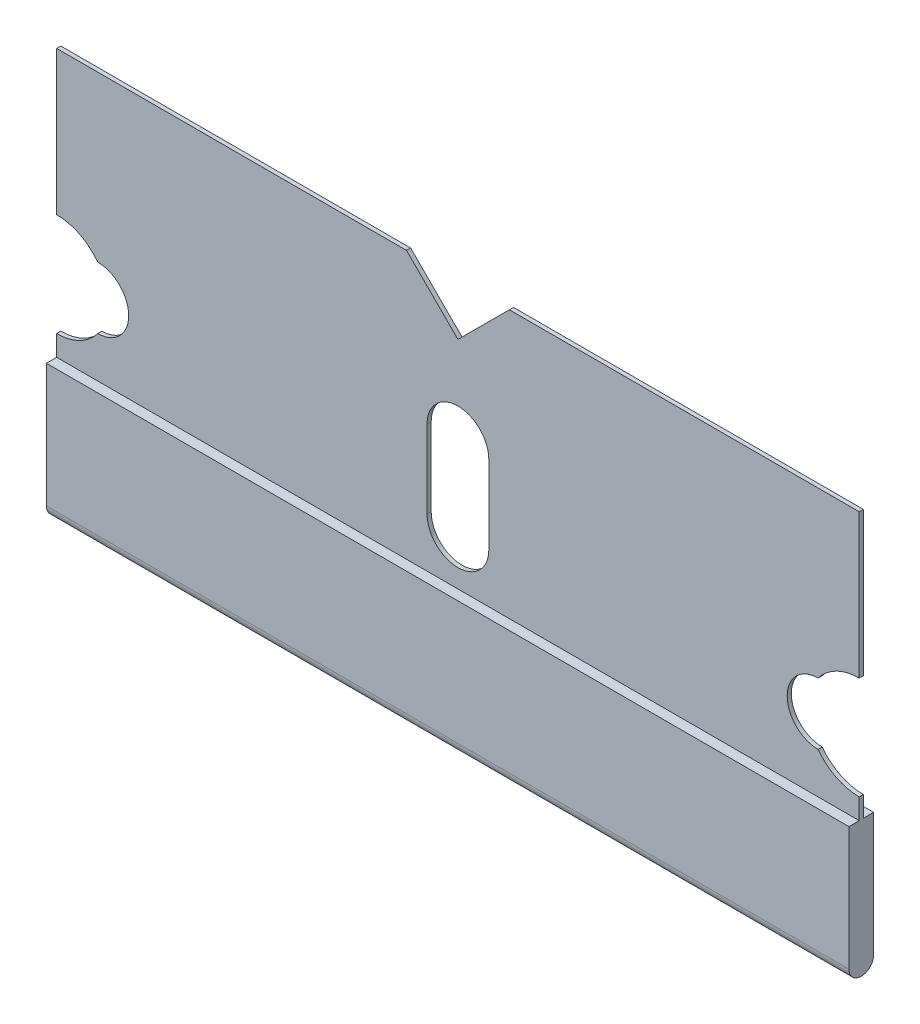
ISO-10303-21;
HEADER;
FILE_DESCRIPTION(('STEP AP214'),'2;1');
FILE_NAME('part.step','',(''),(''),'','','');
FILE_SCHEMA(('AUTOMOTIVE_DESIGN { 1 0 10303 214 1 1 1 1 }'));
ENDSEC;
DATA;
#1=APPLICATION_CONTEXT('core data for automotive mechanical design processes');
#2=APPLICATION_PROTOCOL_DEFINITION('international standard','automotive_design',2000,#1);
#3=PRODUCT_CONTEXT('',#1,'mechanical');
#4=PRODUCT('Part','Part','',(#3));
#5=PRODUCT_RELATED_PRODUCT_CATEGORY('part','',(#4));
#6=PRODUCT_DEFINITION_FORMATION('','',#4);
#7=PRODUCT_DEFINITION_CONTEXT('part definition',#1,'design');
#8=PRODUCT_DEFINITION('design','',#6,#7);
#9=PRODUCT_DEFINITION_SHAPE('','',#8);
#10=(LENGTH_UNIT() NAMED_UNIT(*) SI_UNIT(.MILLI.,.METRE.));
#11=(NAMED_UNIT(*) PLANE_ANGLE_UNIT() SI_UNIT($,.RADIAN.));
#12=(NAMED_UNIT(*) SI_UNIT($,.STERADIAN.) SOLID_ANGLE_UNIT());
#13=UNCERTAINTY_MEASURE_WITH_UNIT(LENGTH_MEASURE(1.E-05),#10,'distance_accuracy_value','');
#14=(GEOMETRIC_REPRESENTATION_CONTEXT(3) GLOBAL_UNCERTAINTY_ASSIGNED_CONTEXT((#13)) GLOBAL_UNIT_ASSIGNED_CONTEXT((#10,
#11,#12)) REPRESENTATION_CONTEXT('',''));
#15=CARTESIAN_POINT('',(0.,0.,0.));
#16=DIRECTION('',(0.,0.,1.));
#17=DIRECTION('',(1.,0.,0.));
#18=AXIS2_PLACEMENT_3D('',#15,#16,#17);
#19=CARTESIAN_POINT('',(0.,19.5,0.2));
#20=DIRECTION('',(0.,-1.,0.));
#21=DIRECTION('',(0.,0.,-1.));
#22=AXIS2_PLACEMENT_3D('',#19,#20,#21);
#23=PLANE('',#22);
#24=DIRECTION('',(-1.,0.,0.));
#25=VECTOR('',#24,1.);
#26=CARTESIAN_POINT('',(0.,19.5,0.));
#27=LINE('',#26,#25);
#28=CARTESIAN_POINT('',(39.,19.5,0.));
#29=VERTEX_POINT('',#28);
#30=CARTESIAN_POINT('',(22.,19.5,0.));
#31=VERTEX_POINT('',#30);
#32=EDGE_CURVE('E240',#29,#31,#27,.T.);
#33=ORIENTED_EDGE('',*,*,#32,.T.);
#34=DIRECTION('',(0.,0.,1.));
#35=VECTOR('',#34,1.);
#36=CARTESIAN_POINT('',(22.,19.5,0.2));
#37=LINE('',#36,#35);
#38=CARTESIAN_POINT('',(22.,19.5,0.2));
#39=VERTEX_POINT('',#38);
#40=EDGE_CURVE('E11',#31,#39,#37,.T.);
#41=ORIENTED_EDGE('',*,*,#40,.T.);
#42=DIRECTION('',(-1.,0.,0.));
#43=VECTOR('',#42,1.);
#44=CARTESIAN_POINT('',(0.,19.5,0.2));
#45=LINE('',#44,#43);
#46=CARTESIAN_POINT('',(39.,19.5,0.2));
#47=VERTEX_POINT('',#46);
#48=EDGE_CURVE('E209',#47,#39,#45,.T.);
#49=ORIENTED_EDGE('',*,*,#48,.F.);
#50=DIRECTION('',(0.,0.,-1.));
#51=VECTOR('',#50,1.);
#52=CARTESIAN_POINT('',(39.,19.5,0.2));
#53=LINE('',#52,#51);
#54=EDGE_CURVE('E264',#47,#29,#53,.T.);
#55=ORIENTED_EDGE('',*,*,#54,.T.);
#56=EDGE_LOOP('',(#33,#41,#49,#55));
#57=FACE_BOUND('',#56,.T.);
#58=ADVANCED_FACE('F34',(#57),#23,.F.);
#59=CARTESIAN_POINT('',(0.,10.,0.2));
#60=DIRECTION('',(0.,0.,-1.));
#61=DIRECTION('',(-1.,0.,0.));
#62=AXIS2_PLACEMENT_3D('',#59,#60,#61);
#63=PLANE('',#62);
#64=ORIENTED_EDGE('',*,*,#48,.T.);
#65=DIRECTION('',(0.707520964718265,0.706692354907095,0.));
#66=VECTOR('',#65,1.);
#67=CARTESIAN_POINT('',(22.,19.5,0.2));
#68=LINE('',#67,#66);
#69=CARTESIAN_POINT('',(19.5,17.002927863104,0.2));
#70=VERTEX_POINT('',#69);
#71=EDGE_CURVE('E203',#70,#39,#68,.T.);
#72=ORIENTED_EDGE('',*,*,#71,.F.);
#73=DIRECTION('',(0.707520964718265,-0.706692354907095,0.));
#74=VECTOR('',#73,1.);
#75=CARTESIAN_POINT('',(17.,19.5,0.2));
#76=LINE('',#75,#74);
#77=CARTESIAN_POINT('',(17.,19.5,0.2));
#78=VERTEX_POINT('',#77);
#79=EDGE_CURVE('E191',#78,#70,#76,.T.);
#80=ORIENTED_EDGE('',*,*,#79,.F.);
#81=CARTESIAN_POINT('',(0.,19.5,0.2));
#82=VERTEX_POINT('',#81);
#83=EDGE_CURVE('E201',#78,#82,#45,.T.);
#84=ORIENTED_EDGE('',*,*,#83,.T.);
#85=DIRECTION('',(0.,-1.,0.));
#86=VECTOR('',#85,1.);
#87=CARTESIAN_POINT('',(0.,12.5,0.2));
#88=LINE('',#87,#86);
#89=CARTESIAN_POINT('',(0.,12.5,0.2));
#90=VERTEX_POINT('',#89);
#91=EDGE_CURVE('E212',#82,#90,#88,.T.);
#92=ORIENTED_EDGE('',*,*,#91,.T.);
#93=CARTESIAN_POINT('',(0.,10.,0.2));
#94=DIRECTION('',(0.,0.,-1.));
#95=DIRECTION('',(-1.,0.,0.));
#96=AXIS2_PLACEMENT_3D('',#93,#94,#95);
#97=CIRCLE('',#96,2.5);
#98=CARTESIAN_POINT('',(1.99999999999999,11.5,0.2));
#99=VERTEX_POINT('',#98);
#100=EDGE_CURVE('E218',#90,#99,#97,.T.);
#101=ORIENTED_EDGE('',*,*,#100,.T.);
#102=CARTESIAN_POINT('',(1.99999999999999,10.,0.2));
#103=DIRECTION('',(0.,0.,-1.));
#104=DIRECTION('',(-1.,0.,0.));
#105=AXIS2_PLACEMENT_3D('',#102,#103,#104);
#106=CIRCLE('',#105,1.5);
#107=CARTESIAN_POINT('',(2.,8.49999999999999,0.2));
#108=VERTEX_POINT('',#107);
#109=EDGE_CURVE('E220',#99,#108,#106,.T.);
#110=ORIENTED_EDGE('',*,*,#109,.T.);
#111=CARTESIAN_POINT('',(0.,10.,0.2));
#112=DIRECTION('',(0.,0.,-1.));
#113=DIRECTION('',(-1.,0.,0.));
#114=AXIS2_PLACEMENT_3D('',#111,#112,#113);
#115=CIRCLE('',#114,2.5);
#116=CARTESIAN_POINT('',(0.,7.5,0.2));
#117=VERTEX_POINT('',#116);
#118=EDGE_CURVE('E222',#108,#117,#115,.T.);
#119=ORIENTED_EDGE('',*,*,#118,.T.);
#120=DIRECTION('',(0.,-1.,0.));
#121=VECTOR('',#120,1.);
#122=CARTESIAN_POINT('',(0.,0.,0.2));
#123=LINE('',#122,#121);
#124=CARTESIAN_POINT('',(0.,6.5,0.2));
#125=VERTEX_POINT('',#124);
#126=EDGE_CURVE('E251',#117,#125,#123,.T.);
#127=ORIENTED_EDGE('',*,*,#126,.T.);
#128=DIRECTION('',(1.,0.,0.));
#129=VECTOR('',#128,1.);
#130=CARTESIAN_POINT('',(-6.70820393249936,6.5,0.2));
#131=LINE('',#130,#129);
#132=CARTESIAN_POINT('',(39.,6.5,0.2));
#133=VERTEX_POINT('',#132);
#134=EDGE_CURVE('E351',#125,#133,#131,.T.);
#135=ORIENTED_EDGE('',*,*,#134,.T.);
#136=DIRECTION('',(0.,1.,0.));
#137=VECTOR('',#136,1.);
#138=CARTESIAN_POINT('',(39.,0.,0.2));
#139=LINE('',#138,#137);
#140=CARTESIAN_POINT('',(39.,7.5,0.2));
#141=VERTEX_POINT('',#140);
#142=EDGE_CURVE('E307',#133,#141,#139,.T.);
#143=ORIENTED_EDGE('',*,*,#142,.T.);
#144=CARTESIAN_POINT('',(39.,10.,0.2));
#145=DIRECTION('',(0.,0.,-1.));
#146=DIRECTION('',(1.,0.,0.));
#147=AXIS2_PLACEMENT_3D('',#144,#145,#146);
#148=CIRCLE('',#147,2.5);
#149=CARTESIAN_POINT('',(37.,8.49999999999999,0.2));
#150=VERTEX_POINT('',#149);
#151=EDGE_CURVE('E283',#141,#150,#148,.T.);
#152=ORIENTED_EDGE('',*,*,#151,.T.);
#153=CARTESIAN_POINT('',(37.,10.,0.2));
#154=DIRECTION('',(0.,0.,-1.));
#155=DIRECTION('',(1.,0.,0.));
#156=AXIS2_PLACEMENT_3D('',#153,#154,#155);
#157=CIRCLE('',#156,1.5);
#158=CARTESIAN_POINT('',(37.,11.5,0.2));
#159=VERTEX_POINT('',#158);
#160=EDGE_CURVE('E303',#150,#159,#157,.T.);
#161=ORIENTED_EDGE('',*,*,#160,.T.);
#162=CARTESIAN_POINT('',(39.,10.,0.2));
#163=DIRECTION('',(0.,0.,-1.));
#164=DIRECTION('',(1.,0.,0.));
#165=AXIS2_PLACEMENT_3D('',#162,#163,#164);
#166=CIRCLE('',#165,2.5);
#167=CARTESIAN_POINT('',(39.,12.5,0.2));
#168=VERTEX_POINT('',#167);
#169=EDGE_CURVE('E213',#159,#168,#166,.T.);
#170=ORIENTED_EDGE('',*,*,#169,.T.);
#171=DIRECTION('',(0.,1.,0.));
#172=VECTOR('',#171,1.);
#173=CARTESIAN_POINT('',(39.,12.5,0.2));
#174=LINE('',#173,#172);
#175=EDGE_CURVE('E210',#168,#47,#174,.T.);
#176=ORIENTED_EDGE('',*,*,#175,.T.);
#177=EDGE_LOOP('',(#64,#72,#80,#84,#92,#101,#110,#119,#127,#135,#143,#152,#161,#170,#176));
#178=FACE_BOUND('',#177,.T.);
#179=CARTESIAN_POINT('',(19.5,12.7,0.2));
#180=DIRECTION('',(0.,0.,1.));
#181=DIRECTION('',(1.,0.,0.));
#182=AXIS2_PLACEMENT_3D('',#179,#180,#181);
#183=CIRCLE('',#182,1.49999999999999);
#184=CARTESIAN_POINT('',(21.,12.7,0.2));
#185=VERTEX_POINT('',#184);
#186=CARTESIAN_POINT('',(18.,12.7,0.2));
#187=VERTEX_POINT('',#186);
#188=EDGE_CURVE('E324',#185,#187,#183,.T.);
#189=ORIENTED_EDGE('',*,*,#188,.F.);
#190=DIRECTION('',(0.,1.,0.));
#191=VECTOR('',#190,1.);
#192=CARTESIAN_POINT('',(21.,12.7,0.2));
#193=LINE('',#192,#191);
#194=CARTESIAN_POINT('',(21.,8.9,0.2));
#195=VERTEX_POINT('',#194);
#196=EDGE_CURVE('E320',#195,#185,#193,.T.);
#197=ORIENTED_EDGE('',*,*,#196,.F.);
#198=CARTESIAN_POINT('',(19.5,8.9,0.2));
#199=DIRECTION('',(0.,0.,1.));
#200=DIRECTION('',(1.,0.,0.));
#201=AXIS2_PLACEMENT_3D('',#198,#199,#200);
#202=CIRCLE('',#201,1.49999999999999);
#203=CARTESIAN_POINT('',(18.,8.9,0.2));
#204=VERTEX_POINT('',#203);
#205=EDGE_CURVE('E336',#204,#195,#202,.T.);
#206=ORIENTED_EDGE('',*,*,#205,.F.);
#207=DIRECTION('',(0.,-1.,0.));
#208=VECTOR('',#207,1.);
#209=CARTESIAN_POINT('',(18.,12.7,0.2));
#210=LINE('',#209,#208);
#211=EDGE_CURVE('E339',#187,#204,#210,.T.);
#212=ORIENTED_EDGE('',*,*,#211,.F.);
#213=EDGE_LOOP('',(#189,#197,#206,#212));
#214=FACE_BOUND('',#213,.T.);
#215=ADVANCED_FACE('F199',(#178,#214),#63,.F.);
#216=CARTESIAN_POINT('',(0.,10.,0.));
#217=DIRECTION('',(0.,0.,-1.));
#218=DIRECTION('',(-1.,0.,0.));
#219=AXIS2_PLACEMENT_3D('',#216,#217,#218);
#220=PLANE('',#219);
#221=DIRECTION('',(-0.707520964718265,-0.706692354907095,0.));
#222=VECTOR('',#221,1.);
#223=CARTESIAN_POINT('',(6.23711311997353,3.75557374993712,0.));
#224=LINE('',#223,#222);
#225=CARTESIAN_POINT('',(19.5,17.002927863104,0.));
#226=VERTEX_POINT('',#225);
#227=EDGE_CURVE('E370',#31,#226,#224,.T.);
#228=ORIENTED_EDGE('',*,*,#227,.F.);
#229=ORIENTED_EDGE('',*,*,#32,.F.);
#230=DIRECTION('',(0.,1.,0.));
#231=VECTOR('',#230,1.);
#232=CARTESIAN_POINT('',(39.,12.5,0.));
#233=LINE('',#232,#231);
#234=CARTESIAN_POINT('',(39.,12.5,0.));
#235=VERTEX_POINT('',#234);
#236=EDGE_CURVE('E237',#235,#29,#233,.T.);
#237=ORIENTED_EDGE('',*,*,#236,.F.);
#238=CARTESIAN_POINT('',(39.,10.,0.));
#239=DIRECTION('',(0.,0.,-1.));
#240=DIRECTION('',(1.,0.,0.));
#241=AXIS2_PLACEMENT_3D('',#238,#239,#240);
#242=CIRCLE('',#241,2.5);
#243=CARTESIAN_POINT('',(37.,11.5,0.));
#244=VERTEX_POINT('',#243);
#245=EDGE_CURVE('E235',#244,#235,#242,.T.);
#246=ORIENTED_EDGE('',*,*,#245,.F.);
#247=CARTESIAN_POINT('',(37.,10.,0.));
#248=DIRECTION('',(0.,0.,-1.));
#249=DIRECTION('',(1.,0.,0.));
#250=AXIS2_PLACEMENT_3D('',#247,#248,#249);
#251=CIRCLE('',#250,1.5);
#252=CARTESIAN_POINT('',(37.,8.49999999999999,0.));
#253=VERTEX_POINT('',#252);
#254=EDGE_CURVE('E233',#253,#244,#251,.T.);
#255=ORIENTED_EDGE('',*,*,#254,.F.);
#256=CARTESIAN_POINT('',(39.,10.,0.));
#257=DIRECTION('',(0.,0.,-1.));
#258=DIRECTION('',(1.,0.,0.));
#259=AXIS2_PLACEMENT_3D('',#256,#257,#258);
#260=CIRCLE('',#259,2.5);
#261=CARTESIAN_POINT('',(39.,7.5,0.));
#262=VERTEX_POINT('',#261);
#263=EDGE_CURVE('E231',#262,#253,#260,.T.);
#264=ORIENTED_EDGE('',*,*,#263,.F.);
#265=DIRECTION('',(0.,1.,0.));
#266=VECTOR('',#265,1.);
#267=CARTESIAN_POINT('',(39.,0.,0.));
#268=LINE('',#267,#266);
#269=CARTESIAN_POINT('',(39.,6.5,0.));
#270=VERTEX_POINT('',#269);
#271=EDGE_CURVE('E228',#270,#262,#268,.T.);
#272=ORIENTED_EDGE('',*,*,#271,.F.);
#273=DIRECTION('',(1.,0.,0.));
#274=VECTOR('',#273,1.);
#275=CARTESIAN_POINT('',(-6.70820393249936,6.5,0.));
#276=LINE('',#275,#274);
#277=CARTESIAN_POINT('',(0.,6.5,0.));
#278=VERTEX_POINT('',#277);
#279=EDGE_CURVE('E349',#278,#270,#276,.T.);
#280=ORIENTED_EDGE('',*,*,#279,.F.);
#281=DIRECTION('',(0.,-1.,0.));
#282=VECTOR('',#281,1.);
#283=CARTESIAN_POINT('',(0.,0.,0.));
#284=LINE('',#283,#282);
#285=CARTESIAN_POINT('',(0.,7.5,0.));
#286=VERTEX_POINT('',#285);
#287=EDGE_CURVE('E225',#286,#278,#284,.T.);
#288=ORIENTED_EDGE('',*,*,#287,.F.);
#289=CARTESIAN_POINT('',(0.,10.,0.));
#290=DIRECTION('',(0.,0.,-1.));
#291=DIRECTION('',(-1.,0.,0.));
#292=AXIS2_PLACEMENT_3D('',#289,#290,#291);
#293=CIRCLE('',#292,2.5);
#294=CARTESIAN_POINT('',(2.,8.49999999999999,0.));
#295=VERTEX_POINT('',#294);
#296=EDGE_CURVE('E249',#295,#286,#293,.T.);
#297=ORIENTED_EDGE('',*,*,#296,.F.);
#298=CARTESIAN_POINT('',(1.99999999999999,10.,0.));
#299=DIRECTION('',(0.,0.,-1.));
#300=DIRECTION('',(-1.,0.,0.));
#301=AXIS2_PLACEMENT_3D('',#298,#299,#300);
#302=CIRCLE('',#301,1.5);
#303=CARTESIAN_POINT('',(1.99999999999999,11.5,0.));
#304=VERTEX_POINT('',#303);
#305=EDGE_CURVE('E247',#304,#295,#302,.T.);
#306=ORIENTED_EDGE('',*,*,#305,.F.);
#307=CARTESIAN_POINT('',(0.,10.,0.));
#308=DIRECTION('',(0.,0.,-1.));
#309=DIRECTION('',(-1.,0.,0.));
#310=AXIS2_PLACEMENT_3D('',#307,#308,#309);
#311=CIRCLE('',#310,2.5);
#312=CARTESIAN_POINT('',(0.,12.5,0.));
#313=VERTEX_POINT('',#312);
#314=EDGE_CURVE('E245',#313,#304,#311,.T.);
#315=ORIENTED_EDGE('',*,*,#314,.F.);
#316=DIRECTION('',(0.,-1.,0.));
#317=VECTOR('',#316,1.);
#318=CARTESIAN_POINT('',(0.,12.5,0.));
#319=LINE('',#318,#317);
#320=CARTESIAN_POINT('',(0.,19.5,0.));
#321=VERTEX_POINT('',#320);
#322=EDGE_CURVE('E243',#321,#313,#319,.T.);
#323=ORIENTED_EDGE('',*,*,#322,.F.);
#324=CARTESIAN_POINT('',(17.,19.5,0.));
#325=VERTEX_POINT('',#324);
#326=EDGE_CURVE('E239',#325,#321,#27,.T.);
#327=ORIENTED_EDGE('',*,*,#326,.F.);
#328=DIRECTION('',(-0.707520964718265,0.706692354907095,0.));
#329=VECTOR('',#328,1.);
#330=CARTESIAN_POINT('',(13.2400361749078,23.2555603613499,0.));
#331=LINE('',#330,#329);
#332=EDGE_CURVE('E49',#226,#325,#331,.T.);
#333=ORIENTED_EDGE('',*,*,#332,.F.);
#334=EDGE_LOOP('',(#228,#229,#237,#246,#255,#264,#272,#280,#288,#297,#306,#315,#323,#327,#333));
#335=FACE_BOUND('',#334,.T.);
#336=DIRECTION('',(0.,1.,0.));
#337=VECTOR('',#336,1.);
#338=CARTESIAN_POINT('',(21.,12.7,0.));
#339=LINE('',#338,#337);
#340=CARTESIAN_POINT('',(21.,8.9,0.));
#341=VERTEX_POINT('',#340);
#342=CARTESIAN_POINT('',(21.,12.7,0.));
#343=VERTEX_POINT('',#342);
#344=EDGE_CURVE('E321',#341,#343,#339,.T.);
#345=ORIENTED_EDGE('',*,*,#344,.T.);
#346=CARTESIAN_POINT('',(19.5,12.7,0.));
#347=DIRECTION('',(0.,0.,1.));
#348=DIRECTION('',(1.,0.,0.));
#349=AXIS2_PLACEMENT_3D('',#346,#347,#348);
#350=CIRCLE('',#349,1.49999999999999);
#351=CARTESIAN_POINT('',(18.,12.7,0.));
#352=VERTEX_POINT('',#351);
#353=EDGE_CURVE('E331',#343,#352,#350,.T.);
#354=ORIENTED_EDGE('',*,*,#353,.T.);
#355=DIRECTION('',(0.,-1.,0.));
#356=VECTOR('',#355,1.);
#357=CARTESIAN_POINT('',(18.,12.7,0.));
#358=LINE('',#357,#356);
#359=CARTESIAN_POINT('',(18.,8.9,0.));
#360=VERTEX_POINT('',#359);
#361=EDGE_CURVE('E328',#352,#360,#358,.T.);
#362=ORIENTED_EDGE('',*,*,#361,.T.);
#363=CARTESIAN_POINT('',(19.5,8.9,0.));
#364=DIRECTION('',(0.,0.,1.));
#365=DIRECTION('',(1.,0.,0.));
#366=AXIS2_PLACEMENT_3D('',#363,#364,#365);
#367=CIRCLE('',#366,1.49999999999999);
#368=EDGE_CURVE('E325',#360,#341,#367,.T.);
#369=ORIENTED_EDGE('',*,*,#368,.T.);
#370=EDGE_LOOP('',(#345,#354,#362,#369));
#371=FACE_BOUND('',#370,.T.);
#372=ADVANCED_FACE('F289',(#335,#371),#220,.T.);
#373=CARTESIAN_POINT('',(0.,0.,0.2));
#374=DIRECTION('',(1.,0.,0.));
#375=DIRECTION('',(0.,1.,0.));
#376=AXIS2_PLACEMENT_3D('',#373,#374,#375);
#377=PLANE('',#376);
#378=ORIENTED_EDGE('',*,*,#287,.T.);
#379=DIRECTION('',(0.,0.,-1.));
#380=VECTOR('',#379,1.);
#381=CARTESIAN_POINT('',(0.,6.5,0.));
#382=LINE('',#381,#380);
#383=CARTESIAN_POINT('',(0.,6.5,-0.5));
#384=VERTEX_POINT('',#383);
#385=EDGE_CURVE('E358',#278,#384,#382,.T.);
#386=ORIENTED_EDGE('',*,*,#385,.T.);
#387=DIRECTION('',(0.,-1.,0.));
#388=VECTOR('',#387,1.);
#389=CARTESIAN_POINT('',(0.,0.500000000000006,-0.5));
#390=LINE('',#389,#388);
#391=CARTESIAN_POINT('',(0.,0.5,-0.5));
#392=VERTEX_POINT('',#391);
#393=EDGE_CURVE('E334',#384,#392,#390,.T.);
#394=ORIENTED_EDGE('',*,*,#393,.T.);
#395=CARTESIAN_POINT('',(0.,0.5,0.0999999999999999));
#396=DIRECTION('',(1.,0.,0.));
#397=DIRECTION('',(0.,1.,0.));
#398=AXIS2_PLACEMENT_3D('',#395,#396,#397);
#399=CIRCLE('',#398,0.6);
#400=CARTESIAN_POINT('',(0.,0.5,0.7));
#401=VERTEX_POINT('',#400);
#402=EDGE_CURVE('E343',#392,#401,#399,.F.);
#403=ORIENTED_EDGE('',*,*,#402,.T.);
#404=DIRECTION('',(0.,1.,0.));
#405=VECTOR('',#404,1.);
#406=CARTESIAN_POINT('',(0.,0.500000000000006,0.7));
#407=LINE('',#406,#405);
#408=CARTESIAN_POINT('',(0.,6.5,0.7));
#409=VERTEX_POINT('',#408);
#410=EDGE_CURVE('E372',#401,#409,#407,.T.);
#411=ORIENTED_EDGE('',*,*,#410,.T.);
#412=DIRECTION('',(0.,0.,-1.));
#413=VECTOR('',#412,1.);
#414=CARTESIAN_POINT('',(0.,6.5,0.7));
#415=LINE('',#414,#413);
#416=EDGE_CURVE('E374',#409,#125,#415,.T.);
#417=ORIENTED_EDGE('',*,*,#416,.T.);
#418=ORIENTED_EDGE('',*,*,#126,.F.);
#419=DIRECTION('',(0.,0.,-1.));
#420=VECTOR('',#419,1.);
#421=CARTESIAN_POINT('',(0.,7.5,0.2));
#422=LINE('',#421,#420);
#423=EDGE_CURVE('E224',#117,#286,#422,.T.);
#424=ORIENTED_EDGE('',*,*,#423,.T.);
#425=EDGE_LOOP('',(#378,#386,#394,#403,#411,#417,#418,#424));
#426=FACE_BOUND('',#425,.T.);
#427=ADVANCED_FACE('F36',(#426),#377,.F.);
#428=CARTESIAN_POINT('',(39.,0.,0.2));
#429=DIRECTION('',(-1.,0.,0.));
#430=DIRECTION('',(0.,0.,1.));
#431=AXIS2_PLACEMENT_3D('',#428,#429,#430);
#432=PLANE('',#431);
#433=ORIENTED_EDGE('',*,*,#142,.F.);
#434=DIRECTION('',(0.,0.,1.));
#435=VECTOR('',#434,1.);
#436=CARTESIAN_POINT('',(39.,6.5,0.7));
#437=LINE('',#436,#435);
#438=CARTESIAN_POINT('',(39.,6.5,0.7));
#439=VERTEX_POINT('',#438);
#440=EDGE_CURVE('E361',#133,#439,#437,.T.);
#441=ORIENTED_EDGE('',*,*,#440,.T.);
#442=DIRECTION('',(0.,-1.,0.));
#443=VECTOR('',#442,1.);
#444=CARTESIAN_POINT('',(39.,0.5,0.7));
#445=LINE('',#444,#443);
#446=CARTESIAN_POINT('',(39.,0.5,0.7));
#447=VERTEX_POINT('',#446);
#448=EDGE_CURVE('E347',#439,#447,#445,.T.);
#449=ORIENTED_EDGE('',*,*,#448,.T.);
#450=CARTESIAN_POINT('',(39.,0.5,0.0999999999999999));
#451=DIRECTION('',(1.,0.,0.));
#452=DIRECTION('',(0.,0.,-1.));
#453=AXIS2_PLACEMENT_3D('',#450,#451,#452);
#454=CIRCLE('',#453,0.6);
#455=CARTESIAN_POINT('',(39.,0.5,-0.5));
#456=VERTEX_POINT('',#455);
#457=EDGE_CURVE('E367',#447,#456,#454,.T.);
#458=ORIENTED_EDGE('',*,*,#457,.T.);
#459=DIRECTION('',(0.,1.,0.));
#460=VECTOR('',#459,1.);
#461=CARTESIAN_POINT('',(39.,0.5,-0.5));
#462=LINE('',#461,#460);
#463=CARTESIAN_POINT('',(39.,6.5,-0.5));
#464=VERTEX_POINT('',#463);
#465=EDGE_CURVE('E365',#456,#464,#462,.T.);
#466=ORIENTED_EDGE('',*,*,#465,.T.);
#467=DIRECTION('',(0.,0.,1.));
#468=VECTOR('',#467,1.);
#469=CARTESIAN_POINT('',(39.,6.5,0.));
#470=LINE('',#469,#468);
#471=EDGE_CURVE('E57',#464,#270,#470,.T.);
#472=ORIENTED_EDGE('',*,*,#471,.T.);
#473=ORIENTED_EDGE('',*,*,#271,.T.);
#474=DIRECTION('',(0.,0.,-1.));
#475=VECTOR('',#474,1.);
#476=CARTESIAN_POINT('',(39.,7.5,0.2));
#477=LINE('',#476,#475);
#478=EDGE_CURVE('E196',#141,#262,#477,.T.);
#479=ORIENTED_EDGE('',*,*,#478,.F.);
#480=EDGE_LOOP('',(#433,#441,#449,#458,#466,#472,#473,#479));
#481=FACE_BOUND('',#480,.T.);
#482=ADVANCED_FACE('F418',(#481),#432,.F.);
#483=CARTESIAN_POINT('',(39.,10.,0.2));
#484=DIRECTION('',(0.,0.,-1.));
#485=DIRECTION('',(-1.,0.,0.));
#486=AXIS2_PLACEMENT_3D('',#483,#484,#485);
#487=CYLINDRICAL_SURFACE('',#486,2.5);
#488=ORIENTED_EDGE('',*,*,#263,.T.);
#489=DIRECTION('',(0.,0.,-1.));
#490=VECTOR('',#489,1.);
#491=CARTESIAN_POINT('',(37.,8.49999999999999,0.2));
#492=LINE('',#491,#490);
#493=EDGE_CURVE('E273',#150,#253,#492,.T.);
#494=ORIENTED_EDGE('',*,*,#493,.F.);
#495=ORIENTED_EDGE('',*,*,#151,.F.);
#496=ORIENTED_EDGE('',*,*,#478,.T.);
#497=EDGE_LOOP('',(#488,#494,#495,#496));
#498=FACE_BOUND('',#497,.T.);
#499=ADVANCED_FACE('F281',(#498),#487,.F.);
#500=CARTESIAN_POINT('',(37.,10.,0.2));
#501=DIRECTION('',(0.,0.,-1.));
#502=DIRECTION('',(-1.,0.,0.));
#503=AXIS2_PLACEMENT_3D('',#500,#501,#502);
#504=CYLINDRICAL_SURFACE('',#503,1.5);
#505=ORIENTED_EDGE('',*,*,#254,.T.);
#506=DIRECTION('',(0.,0.,-1.));
#507=VECTOR('',#506,1.);
#508=CARTESIAN_POINT('',(37.,11.5,0.2));
#509=LINE('',#508,#507);
#510=EDGE_CURVE('E270',#159,#244,#509,.T.);
#511=ORIENTED_EDGE('',*,*,#510,.F.);
#512=ORIENTED_EDGE('',*,*,#160,.F.);
#513=ORIENTED_EDGE('',*,*,#493,.T.);
#514=EDGE_LOOP('',(#505,#511,#512,#513));
#515=FACE_BOUND('',#514,.T.);
#516=ADVANCED_FACE('F296',(#515),#504,.F.);
#517=CARTESIAN_POINT('',(39.,10.,0.2));
#518=DIRECTION('',(0.,0.,-1.));
#519=DIRECTION('',(-1.,0.,0.));
#520=AXIS2_PLACEMENT_3D('',#517,#518,#519);
#521=CYLINDRICAL_SURFACE('',#520,2.5);
#522=ORIENTED_EDGE('',*,*,#245,.T.);
#523=DIRECTION('',(0.,0.,-1.));
#524=VECTOR('',#523,1.);
#525=CARTESIAN_POINT('',(39.,12.5,0.2));
#526=LINE('',#525,#524);
#527=EDGE_CURVE('E267',#168,#235,#526,.T.);
#528=ORIENTED_EDGE('',*,*,#527,.F.);
#529=ORIENTED_EDGE('',*,*,#169,.F.);
#530=ORIENTED_EDGE('',*,*,#510,.T.);
#531=EDGE_LOOP('',(#522,#528,#529,#530));
#532=FACE_BOUND('',#531,.T.);
#533=ADVANCED_FACE('F300',(#532),#521,.F.);
#534=CARTESIAN_POINT('',(39.,12.5,0.2));
#535=DIRECTION('',(-1.,0.,0.));
#536=DIRECTION('',(0.,0.,1.));
#537=AXIS2_PLACEMENT_3D('',#534,#535,#536);
#538=PLANE('',#537);
#539=ORIENTED_EDGE('',*,*,#236,.T.);
#540=ORIENTED_EDGE('',*,*,#54,.F.);
#541=ORIENTED_EDGE('',*,*,#175,.F.);
#542=ORIENTED_EDGE('',*,*,#527,.T.);
#543=EDGE_LOOP('',(#539,#540,#541,#542));
#544=FACE_BOUND('',#543,.T.);
#545=ADVANCED_FACE('F388',(#544),#538,.F.);
#546=ORIENTED_EDGE('',*,*,#83,.F.);
#547=DIRECTION('',(0.,0.,-1.));
#548=VECTOR('',#547,1.);
#549=CARTESIAN_POINT('',(17.,19.5,0.2));
#550=LINE('',#549,#548);
#551=EDGE_CURVE('E42',#78,#325,#550,.T.);
#552=ORIENTED_EDGE('',*,*,#551,.T.);
#553=ORIENTED_EDGE('',*,*,#326,.T.);
#554=DIRECTION('',(0.,0.,-1.));
#555=VECTOR('',#554,1.);
#556=CARTESIAN_POINT('',(0.,19.5,0.2));
#557=LINE('',#556,#555);
#558=EDGE_CURVE('E207',#82,#321,#557,.T.);
#559=ORIENTED_EDGE('',*,*,#558,.F.);
#560=EDGE_LOOP('',(#546,#552,#553,#559));
#561=FACE_BOUND('',#560,.T.);
#562=ADVANCED_FACE('F205',(#561),#23,.F.);
#563=CARTESIAN_POINT('',(0.,12.5,0.2));
#564=DIRECTION('',(1.,0.,0.));
#565=DIRECTION('',(0.,1.,0.));
#566=AXIS2_PLACEMENT_3D('',#563,#564,#565);
#567=PLANE('',#566);
#568=ORIENTED_EDGE('',*,*,#322,.T.);
#569=DIRECTION('',(0.,0.,-1.));
#570=VECTOR('',#569,1.);
#571=CARTESIAN_POINT('',(0.,12.5,0.2));
#572=LINE('',#571,#570);
#573=EDGE_CURVE('E260',#90,#313,#572,.T.);
#574=ORIENTED_EDGE('',*,*,#573,.F.);
#575=ORIENTED_EDGE('',*,*,#91,.F.);
#576=ORIENTED_EDGE('',*,*,#558,.T.);
#577=EDGE_LOOP('',(#568,#574,#575,#576));
#578=FACE_BOUND('',#577,.T.);
#579=ADVANCED_FACE('F392',(#578),#567,.F.);
#580=CARTESIAN_POINT('',(0.,10.,0.2));
#581=DIRECTION('',(0.,0.,-1.));
#582=DIRECTION('',(-1.,0.,0.));
#583=AXIS2_PLACEMENT_3D('',#580,#581,#582);
#584=CYLINDRICAL_SURFACE('',#583,2.5);
#585=ORIENTED_EDGE('',*,*,#314,.T.);
#586=DIRECTION('',(0.,0.,-1.));
#587=VECTOR('',#586,1.);
#588=CARTESIAN_POINT('',(1.99999999999999,11.5,0.2));
#589=LINE('',#588,#587);
#590=EDGE_CURVE('E257',#99,#304,#589,.T.);
#591=ORIENTED_EDGE('',*,*,#590,.F.);
#592=ORIENTED_EDGE('',*,*,#100,.F.);
#593=ORIENTED_EDGE('',*,*,#573,.T.);
#594=EDGE_LOOP('',(#585,#591,#592,#593));
#595=FACE_BOUND('',#594,.T.);
#596=ADVANCED_FACE('F399',(#595),#584,.F.);
#597=CARTESIAN_POINT('',(1.99999999999999,10.,0.2));
#598=DIRECTION('',(0.,0.,-1.));
#599=DIRECTION('',(-1.,0.,0.));
#600=AXIS2_PLACEMENT_3D('',#597,#598,#599);
#601=CYLINDRICAL_SURFACE('',#600,1.5);
#602=ORIENTED_EDGE('',*,*,#305,.T.);
#603=DIRECTION('',(0.,0.,-1.));
#604=VECTOR('',#603,1.);
#605=CARTESIAN_POINT('',(2.,8.49999999999999,0.2));
#606=LINE('',#605,#604);
#607=EDGE_CURVE('E254',#108,#295,#606,.T.);
#608=ORIENTED_EDGE('',*,*,#607,.F.);
#609=ORIENTED_EDGE('',*,*,#109,.F.);
#610=ORIENTED_EDGE('',*,*,#590,.T.);
#611=EDGE_LOOP('',(#602,#608,#609,#610));
#612=FACE_BOUND('',#611,.T.);
#613=ADVANCED_FACE('F402',(#612),#601,.F.);
#614=CARTESIAN_POINT('',(0.,10.,0.2));
#615=DIRECTION('',(0.,0.,-1.));
#616=DIRECTION('',(-1.,0.,0.));
#617=AXIS2_PLACEMENT_3D('',#614,#615,#616);
#618=CYLINDRICAL_SURFACE('',#617,2.5);
#619=ORIENTED_EDGE('',*,*,#296,.T.);
#620=ORIENTED_EDGE('',*,*,#423,.F.);
#621=ORIENTED_EDGE('',*,*,#118,.F.);
#622=ORIENTED_EDGE('',*,*,#607,.T.);
#623=EDGE_LOOP('',(#619,#620,#621,#622));
#624=FACE_BOUND('',#623,.T.);
#625=ADVANCED_FACE('F407',(#624),#618,.F.);
#626=CARTESIAN_POINT('',(19.5,12.7,0.2));
#627=DIRECTION('',(0.,0.,-1.));
#628=DIRECTION('',(-1.,0.,0.));
#629=AXIS2_PLACEMENT_3D('',#626,#627,#628);
#630=CYLINDRICAL_SURFACE('',#629,1.49999999999999);
#631=ORIENTED_EDGE('',*,*,#353,.F.);
#632=DIRECTION('',(0.,0.,-1.));
#633=VECTOR('',#632,1.);
#634=CARTESIAN_POINT('',(21.,12.7,0.2));
#635=LINE('',#634,#633);
#636=EDGE_CURVE('E317',#185,#343,#635,.T.);
#637=ORIENTED_EDGE('',*,*,#636,.F.);
#638=ORIENTED_EDGE('',*,*,#188,.T.);
#639=DIRECTION('',(0.,0.,-1.));
#640=VECTOR('',#639,1.);
#641=CARTESIAN_POINT('',(18.,12.7,0.2));
#642=LINE('',#641,#640);
#643=EDGE_CURVE('E229',#187,#352,#642,.T.);
#644=ORIENTED_EDGE('',*,*,#643,.T.);
#645=EDGE_LOOP('',(#631,#637,#638,#644));
#646=FACE_BOUND('',#645,.T.);
#647=ADVANCED_FACE('F477',(#646),#630,.F.);
#648=CARTESIAN_POINT('',(18.,12.7,0.2));
#649=DIRECTION('',(1.,0.,0.));
#650=DIRECTION('',(0.,0.,-1.));
#651=AXIS2_PLACEMENT_3D('',#648,#649,#650);
#652=PLANE('',#651);
#653=ORIENTED_EDGE('',*,*,#361,.F.);
#654=ORIENTED_EDGE('',*,*,#643,.F.);
#655=ORIENTED_EDGE('',*,*,#211,.T.);
#656=DIRECTION('',(0.,0.,-1.));
#657=VECTOR('',#656,1.);
#658=CARTESIAN_POINT('',(18.,8.9,0.2));
#659=LINE('',#658,#657);
#660=EDGE_CURVE('E313',#204,#360,#659,.T.);
#661=ORIENTED_EDGE('',*,*,#660,.T.);
#662=EDGE_LOOP('',(#653,#654,#655,#661));
#663=FACE_BOUND('',#662,.T.);
#664=ADVANCED_FACE('F499',(#663),#652,.T.);
#665=CARTESIAN_POINT('',(19.5,8.9,0.2));
#666=DIRECTION('',(0.,0.,-1.));
#667=DIRECTION('',(-1.,0.,0.));
#668=AXIS2_PLACEMENT_3D('',#665,#666,#667);
#669=CYLINDRICAL_SURFACE('',#668,1.49999999999999);
#670=ORIENTED_EDGE('',*,*,#368,.F.);
#671=ORIENTED_EDGE('',*,*,#660,.F.);
#672=ORIENTED_EDGE('',*,*,#205,.T.);
#673=DIRECTION('',(0.,0.,-1.));
#674=VECTOR('',#673,1.);
#675=CARTESIAN_POINT('',(21.,8.9,0.2));
#676=LINE('',#675,#674);
#677=EDGE_CURVE('E315',#195,#341,#676,.T.);
#678=ORIENTED_EDGE('',*,*,#677,.T.);
#679=EDGE_LOOP('',(#670,#671,#672,#678));
#680=FACE_BOUND('',#679,.T.);
#681=ADVANCED_FACE('F506',(#680),#669,.F.);
#682=CARTESIAN_POINT('',(21.,12.7,0.2));
#683=DIRECTION('',(-1.,0.,0.));
#684=DIRECTION('',(0.,0.,1.));
#685=AXIS2_PLACEMENT_3D('',#682,#683,#684);
#686=PLANE('',#685);
#687=ORIENTED_EDGE('',*,*,#344,.F.);
#688=ORIENTED_EDGE('',*,*,#677,.F.);
#689=ORIENTED_EDGE('',*,*,#196,.T.);
#690=ORIENTED_EDGE('',*,*,#636,.T.);
#691=EDGE_LOOP('',(#687,#688,#689,#690));
#692=FACE_BOUND('',#691,.T.);
#693=ADVANCED_FACE('F514',(#692),#686,.T.);
#694=CARTESIAN_POINT('',(-6.70820393249936,0.5,0.0999999999999999));
#695=DIRECTION('',(1.,0.,0.));
#696=DIRECTION('',(0.,0.,-1.));
#697=AXIS2_PLACEMENT_3D('',#694,#695,#696);
#698=CYLINDRICAL_SURFACE('',#697,0.6);
#699=ORIENTED_EDGE('',*,*,#402,.F.);
#700=DIRECTION('',(1.,0.,0.));
#701=VECTOR('',#700,1.);
#702=CARTESIAN_POINT('',(-6.70820393249936,0.5,-0.5));
#703=LINE('',#702,#701);
#704=EDGE_CURVE('E344',#392,#456,#703,.T.);
#705=ORIENTED_EDGE('',*,*,#704,.T.);
#706=ORIENTED_EDGE('',*,*,#457,.F.);
#707=DIRECTION('',(1.,0.,0.));
#708=VECTOR('',#707,1.);
#709=CARTESIAN_POINT('',(-6.70820393249936,0.5,0.7));
#710=LINE('',#709,#708);
#711=EDGE_CURVE('E356',#401,#447,#710,.T.);
#712=ORIENTED_EDGE('',*,*,#711,.F.);
#713=EDGE_LOOP('',(#699,#705,#706,#712));
#714=FACE_BOUND('',#713,.T.);
#715=ADVANCED_FACE('F425',(#714),#698,.T.);
#716=CARTESIAN_POINT('',(-6.70820393249936,0.5,0.7));
#717=DIRECTION('',(0.,0.,1.));
#718=DIRECTION('',(1.,0.,0.));
#719=AXIS2_PLACEMENT_3D('',#716,#717,#718);
#720=PLANE('',#719);
#721=ORIENTED_EDGE('',*,*,#410,.F.);
#722=ORIENTED_EDGE('',*,*,#711,.T.);
#723=ORIENTED_EDGE('',*,*,#448,.F.);
#724=DIRECTION('',(1.,0.,0.));
#725=VECTOR('',#724,1.);
#726=CARTESIAN_POINT('',(-6.70820393249936,6.5,0.7));
#727=LINE('',#726,#725);
#728=EDGE_CURVE('E354',#409,#439,#727,.T.);
#729=ORIENTED_EDGE('',*,*,#728,.F.);
#730=EDGE_LOOP('',(#721,#722,#723,#729));
#731=FACE_BOUND('',#730,.T.);
#732=ADVANCED_FACE('F420',(#731),#720,.T.);
#733=CARTESIAN_POINT('',(-6.70820393249936,6.5,0.7));
#734=DIRECTION('',(0.,1.,0.));
#735=DIRECTION('',(0.,0.,1.));
#736=AXIS2_PLACEMENT_3D('',#733,#734,#735);
#737=PLANE('',#736);
#738=ORIENTED_EDGE('',*,*,#416,.F.);
#739=ORIENTED_EDGE('',*,*,#728,.T.);
#740=ORIENTED_EDGE('',*,*,#440,.F.);
#741=ORIENTED_EDGE('',*,*,#134,.F.);
#742=EDGE_LOOP('',(#738,#739,#740,#741));
#743=FACE_BOUND('',#742,.T.);
#744=ADVANCED_FACE('F416',(#743),#737,.T.);
#745=CARTESIAN_POINT('',(-6.70820393249936,6.5,0.));
#746=DIRECTION('',(0.,1.,0.));
#747=DIRECTION('',(0.,0.,1.));
#748=AXIS2_PLACEMENT_3D('',#745,#746,#747);
#749=PLANE('',#748);
#750=ORIENTED_EDGE('',*,*,#385,.F.);
#751=ORIENTED_EDGE('',*,*,#279,.T.);
#752=ORIENTED_EDGE('',*,*,#471,.F.);
#753=DIRECTION('',(1.,0.,0.));
#754=VECTOR('',#753,1.);
#755=CARTESIAN_POINT('',(-6.70820393249936,6.5,-0.5));
#756=LINE('',#755,#754);
#757=EDGE_CURVE('E346',#384,#464,#756,.T.);
#758=ORIENTED_EDGE('',*,*,#757,.F.);
#759=EDGE_LOOP('',(#750,#751,#752,#758));
#760=FACE_BOUND('',#759,.T.);
#761=ADVANCED_FACE('F433',(#760),#749,.T.);
#762=CARTESIAN_POINT('',(-6.70820393249936,0.5,-0.5));
#763=DIRECTION('',(0.,0.,-1.));
#764=DIRECTION('',(-1.,0.,0.));
#765=AXIS2_PLACEMENT_3D('',#762,#763,#764);
#766=PLANE('',#765);
#767=ORIENTED_EDGE('',*,*,#393,.F.);
#768=ORIENTED_EDGE('',*,*,#757,.T.);
#769=ORIENTED_EDGE('',*,*,#465,.F.);
#770=ORIENTED_EDGE('',*,*,#704,.F.);
#771=EDGE_LOOP('',(#767,#768,#769,#770));
#772=FACE_BOUND('',#771,.T.);
#773=ADVANCED_FACE('F430',(#772),#766,.T.);
#774=CARTESIAN_POINT('',(22.,19.5,-9.8));
#775=DIRECTION('',(0.706692354907095,-0.707520964718265,0.));
#776=DIRECTION('',(0.707520964718265,0.706692354907095,0.));
#777=AXIS2_PLACEMENT_3D('',#774,#775,#776);
#778=PLANE('',#777);
#779=ORIENTED_EDGE('',*,*,#227,.T.);
#780=DIRECTION('',(0.,0.,1.));
#781=VECTOR('',#780,1.);
#782=CARTESIAN_POINT('',(19.5,17.002927863104,-9.8));
#783=LINE('',#782,#781);
#784=EDGE_CURVE('E379',#226,#70,#783,.T.);
#785=ORIENTED_EDGE('',*,*,#784,.T.);
#786=ORIENTED_EDGE('',*,*,#71,.T.);
#787=ORIENTED_EDGE('',*,*,#40,.F.);
#788=EDGE_LOOP('',(#779,#785,#786,#787));
#789=FACE_BOUND('',#788,.T.);
#790=ADVANCED_FACE('F382',(#789),#778,.F.);
#791=CARTESIAN_POINT('',(17.,19.5,-9.8));
#792=DIRECTION('',(-0.706692354907095,-0.707520964718265,0.));
#793=DIRECTION('',(0.707520964718265,-0.706692354907095,0.));
#794=AXIS2_PLACEMENT_3D('',#791,#792,#793);
#795=PLANE('',#794);
#796=ORIENTED_EDGE('',*,*,#332,.T.);
#797=ORIENTED_EDGE('',*,*,#551,.F.);
#798=ORIENTED_EDGE('',*,*,#79,.T.);
#799=ORIENTED_EDGE('',*,*,#784,.F.);
#800=EDGE_LOOP('',(#796,#797,#798,#799));
#801=FACE_BOUND('',#800,.T.);
#802=ADVANCED_FACE('F190',(#801),#795,.F.);
#803=CLOSED_SHELL('',(#58,#215,#372,#427,#482,#499,#516,#533,#545,#562,#579,#596,#613,#625,#647,
#664,#681,#693,#715,#732,#744,#761,#773,#790,#802));
#804=MANIFOLD_SOLID_BREP('B2',#803);
#805=ADVANCED_BREP_SHAPE_REPRESENTATION('',(#18,#804),#14);
#806=SHAPE_DEFINITION_REPRESENTATION(#9,#805);
ENDSEC;
END-ISO-10303-21;
